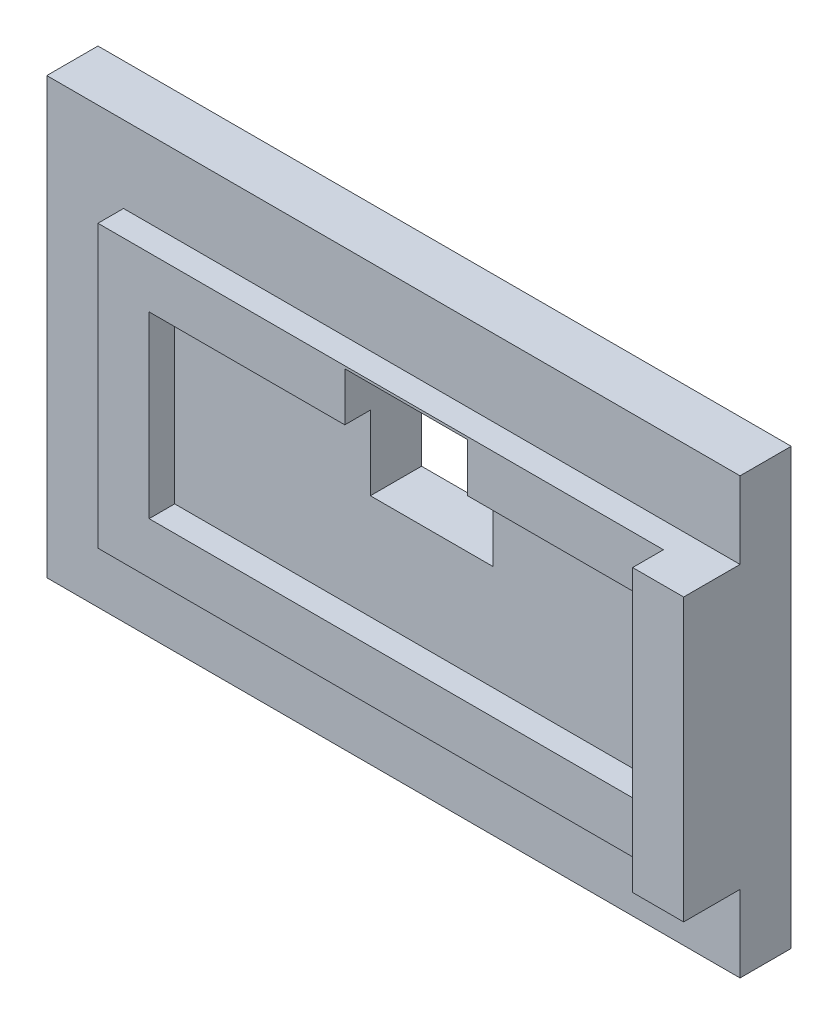
ISO-10303-21;
HEADER;
FILE_DESCRIPTION(('STEP AP214'),'2;1');
FILE_NAME('part.step','',(''),(''),'','','');
FILE_SCHEMA(('AUTOMOTIVE_DESIGN { 1 0 10303 214 1 1 1 1 }'));
ENDSEC;
DATA;
#1=APPLICATION_CONTEXT('core data for automotive mechanical design processes');
#2=APPLICATION_PROTOCOL_DEFINITION('international standard','automotive_design',2000,#1);
#3=PRODUCT_CONTEXT('',#1,'mechanical');
#4=PRODUCT('Part','Part','',(#3));
#5=PRODUCT_RELATED_PRODUCT_CATEGORY('part','',(#4));
#6=PRODUCT_DEFINITION_FORMATION('','',#4);
#7=PRODUCT_DEFINITION_CONTEXT('part definition',#1,'design');
#8=PRODUCT_DEFINITION('design','',#6,#7);
#9=PRODUCT_DEFINITION_SHAPE('','',#8);
#10=(LENGTH_UNIT() NAMED_UNIT(*) SI_UNIT(.MILLI.,.METRE.));
#11=(NAMED_UNIT(*) PLANE_ANGLE_UNIT() SI_UNIT($,.RADIAN.));
#12=(NAMED_UNIT(*) SI_UNIT($,.STERADIAN.) SOLID_ANGLE_UNIT());
#13=UNCERTAINTY_MEASURE_WITH_UNIT(LENGTH_MEASURE(1.E-05),#10,'distance_accuracy_value','');
#14=(GEOMETRIC_REPRESENTATION_CONTEXT(3) GLOBAL_UNCERTAINTY_ASSIGNED_CONTEXT((#13)) GLOBAL_UNIT_ASSIGNED_CONTEXT((#10,
#11,#12)) REPRESENTATION_CONTEXT('',''));
#15=CARTESIAN_POINT('',(0.,0.,0.));
#16=DIRECTION('',(0.,0.,1.));
#17=DIRECTION('',(1.,0.,0.));
#18=AXIS2_PLACEMENT_3D('',#15,#16,#17);
#19=CARTESIAN_POINT('',(-127.62484,44.44978283,38.1));
#20=DIRECTION('',(0.,-1.,0.));
#21=DIRECTION('',(1.,0.,0.));
#22=AXIS2_PLACEMENT_3D('',#19,#20,#21);
#23=PLANE('',#22);
#24=DIRECTION('',(0.,0.,-1.));
#25=VECTOR('',#24,1.);
#26=CARTESIAN_POINT('',(-30.48,44.44978283,38.1));
#27=LINE('',#26,#25);
#28=CARTESIAN_POINT('',(-30.48,44.44978283,38.1));
#29=VERTEX_POINT('',#28);
#30=CARTESIAN_POINT('',(-30.48,44.44978283,25.4));
#31=VERTEX_POINT('',#30);
#32=EDGE_CURVE('E235',#29,#31,#27,.T.);
#33=ORIENTED_EDGE('',*,*,#32,.F.);
#34=DIRECTION('',(-1.,0.,0.));
#35=VECTOR('',#34,1.);
#36=CARTESIAN_POINT('',(-127.62484,44.44978283,38.1));
#37=LINE('',#36,#35);
#38=CARTESIAN_POINT('',(-127.62484,44.44978283,38.1));
#39=VERTEX_POINT('',#38);
#40=EDGE_CURVE('E271',#29,#39,#37,.T.);
#41=ORIENTED_EDGE('',*,*,#40,.T.);
#42=DIRECTION('',(0.,0.,-1.));
#43=VECTOR('',#42,1.);
#44=CARTESIAN_POINT('',(-127.62484,44.44978283,38.1));
#45=LINE('',#44,#43);
#46=CARTESIAN_POINT('',(-127.62484,44.44978283,25.4));
#47=VERTEX_POINT('',#46);
#48=EDGE_CURVE('E275',#39,#47,#45,.T.);
#49=ORIENTED_EDGE('',*,*,#48,.T.);
#50=DIRECTION('',(-1.,0.,0.));
#51=VECTOR('',#50,1.);
#52=CARTESIAN_POINT('',(-127.62484,44.44978283,25.4));
#53=LINE('',#52,#51);
#54=EDGE_CURVE('E284',#31,#47,#53,.T.);
#55=ORIENTED_EDGE('',*,*,#54,.F.);
#56=EDGE_LOOP('',(#33,#41,#49,#55));
#57=FACE_BOUND('',#56,.T.);
#58=ADVANCED_FACE('F45',(#57),#23,.T.);
#59=CARTESIAN_POINT('',(0.,0.,38.1));
#60=DIRECTION('',(0.,0.,-1.));
#61=DIRECTION('',(-1.,0.,0.));
#62=AXIS2_PLACEMENT_3D('',#59,#60,#61);
#63=PLANE('',#62);
#64=ORIENTED_EDGE('',*,*,#40,.F.);
#65=DIRECTION('',(0.,1.,0.));
#66=VECTOR('',#65,1.);
#67=CARTESIAN_POINT('',(-30.48,0.,38.1));
#68=LINE('',#67,#66);
#69=CARTESIAN_POINT('',(-30.48,68.58,38.1));
#70=VERTEX_POINT('',#69);
#71=EDGE_CURVE('E237',#29,#70,#68,.T.);
#72=ORIENTED_EDGE('',*,*,#71,.T.);
#73=DIRECTION('',(1.,0.,0.));
#74=VECTOR('',#73,1.);
#75=CARTESIAN_POINT('',(0.,68.58,38.1));
#76=LINE('',#75,#74);
#77=CARTESIAN_POINT('',(30.48,68.58,38.1));
#78=VERTEX_POINT('',#77);
#79=EDGE_CURVE('E240',#70,#78,#76,.T.);
#80=ORIENTED_EDGE('',*,*,#79,.T.);
#81=DIRECTION('',(0.,-1.,0.));
#82=VECTOR('',#81,1.);
#83=CARTESIAN_POINT('',(30.48,0.,38.1));
#84=LINE('',#83,#82);
#85=CARTESIAN_POINT('',(30.48,44.44978283,38.1));
#86=VERTEX_POINT('',#85);
#87=EDGE_CURVE('E232',#78,#86,#84,.T.);
#88=ORIENTED_EDGE('',*,*,#87,.T.);
#89=CARTESIAN_POINT('',(127.62484,44.44978283,38.1));
#90=VERTEX_POINT('',#89);
#91=EDGE_CURVE('E272',#90,#86,#37,.T.);
#92=ORIENTED_EDGE('',*,*,#91,.F.);
#93=DIRECTION('',(0.,1.,0.));
#94=VECTOR('',#93,1.);
#95=CARTESIAN_POINT('',(127.62484,-44.44978283,38.1));
#96=LINE('',#95,#94);
#97=CARTESIAN_POINT('',(127.62484,-44.44978283,38.1));
#98=VERTEX_POINT('',#97);
#99=EDGE_CURVE('E268',#98,#90,#96,.T.);
#100=ORIENTED_EDGE('',*,*,#99,.F.);
#101=DIRECTION('',(1.,0.,0.));
#102=VECTOR('',#101,1.);
#103=CARTESIAN_POINT('',(-127.62484,-44.44978283,38.1));
#104=LINE('',#103,#102);
#105=CARTESIAN_POINT('',(-127.62484,-44.44978283,38.1));
#106=VERTEX_POINT('',#105);
#107=EDGE_CURVE('E265',#106,#98,#104,.T.);
#108=ORIENTED_EDGE('',*,*,#107,.F.);
#109=DIRECTION('',(0.,-1.,0.));
#110=VECTOR('',#109,1.);
#111=CARTESIAN_POINT('',(-127.62484,-44.44978283,38.1));
#112=LINE('',#111,#110);
#113=EDGE_CURVE('E263',#39,#106,#112,.T.);
#114=ORIENTED_EDGE('',*,*,#113,.F.);
#115=EDGE_LOOP('',(#64,#72,#80,#88,#92,#100,#108,#114));
#116=FACE_BOUND('',#115,.T.);
#117=DIRECTION('',(0.,-1.,0.));
#118=VECTOR('',#117,1.);
#119=CARTESIAN_POINT('',(127.696800697553,-69.84978283,38.1));
#120=LINE('',#119,#118);
#121=CARTESIAN_POINT('',(127.696800697553,69.84978283,38.1));
#122=VERTEX_POINT('',#121);
#123=CARTESIAN_POINT('',(127.696800697553,-69.84978283,38.1));
#124=VERTEX_POINT('',#123);
#125=EDGE_CURVE('E243',#122,#124,#120,.T.);
#126=ORIENTED_EDGE('',*,*,#125,.F.);
#127=DIRECTION('',(-1.,0.,0.));
#128=VECTOR('',#127,1.);
#129=CARTESIAN_POINT('',(-153.02484,69.84978283,38.1));
#130=LINE('',#129,#128);
#131=CARTESIAN_POINT('',(-153.02484,69.84978283,38.1));
#132=VERTEX_POINT('',#131);
#133=EDGE_CURVE('E298',#122,#132,#130,.T.);
#134=ORIENTED_EDGE('',*,*,#133,.T.);
#135=DIRECTION('',(0.,-1.,0.));
#136=VECTOR('',#135,1.);
#137=CARTESIAN_POINT('',(-153.02484,-69.84978283,38.1));
#138=LINE('',#137,#136);
#139=CARTESIAN_POINT('',(-153.02484,-69.84978283,38.1));
#140=VERTEX_POINT('',#139);
#141=EDGE_CURVE('E300',#132,#140,#138,.T.);
#142=ORIENTED_EDGE('',*,*,#141,.T.);
#143=DIRECTION('',(1.,0.,0.));
#144=VECTOR('',#143,1.);
#145=CARTESIAN_POINT('',(-153.02484,-69.84978283,38.1));
#146=LINE('',#145,#144);
#147=EDGE_CURVE('E303',#140,#124,#146,.T.);
#148=ORIENTED_EDGE('',*,*,#147,.T.);
#149=EDGE_LOOP('',(#126,#134,#142,#148));
#150=FACE_BOUND('',#149,.T.);
#151=ADVANCED_FACE('F355',(#116,#150),#63,.F.);
#152=CARTESIAN_POINT('',(0.,-107.95,25.4));
#153=DIRECTION('',(0.,1.,0.));
#154=DIRECTION('',(0.,0.,1.));
#155=AXIS2_PLACEMENT_3D('',#152,#153,#154);
#156=PLANE('',#155);
#157=DIRECTION('',(1.,0.,0.));
#158=VECTOR('',#157,1.);
#159=CARTESIAN_POINT('',(0.,-107.95,0.));
#160=LINE('',#159,#158);
#161=CARTESIAN_POINT('',(-191.12484,-107.95,0.));
#162=VERTEX_POINT('',#161);
#163=CARTESIAN_POINT('',(153.02484,-107.95,0.));
#164=VERTEX_POINT('',#163);
#165=EDGE_CURVE('E184',#162,#164,#160,.T.);
#166=ORIENTED_EDGE('',*,*,#165,.T.);
#167=DIRECTION('',(0.,0.,-1.));
#168=VECTOR('',#167,1.);
#169=CARTESIAN_POINT('',(153.02484,-107.95,25.4));
#170=LINE('',#169,#168);
#171=CARTESIAN_POINT('',(153.02484,-107.95,25.4));
#172=VERTEX_POINT('',#171);
#173=EDGE_CURVE('E331',#172,#164,#170,.T.);
#174=ORIENTED_EDGE('',*,*,#173,.F.);
#175=DIRECTION('',(1.,0.,0.));
#176=VECTOR('',#175,1.);
#177=CARTESIAN_POINT('',(0.,-107.95,25.4));
#178=LINE('',#177,#176);
#179=CARTESIAN_POINT('',(-191.12484,-107.95,25.4));
#180=VERTEX_POINT('',#179);
#181=EDGE_CURVE('E200',#180,#172,#178,.T.);
#182=ORIENTED_EDGE('',*,*,#181,.F.);
#183=DIRECTION('',(0.,0.,1.));
#184=VECTOR('',#183,1.);
#185=CARTESIAN_POINT('',(-191.12484,-107.95,0.));
#186=LINE('',#185,#184);
#187=EDGE_CURVE('E198',#162,#180,#186,.T.);
#188=ORIENTED_EDGE('',*,*,#187,.F.);
#189=EDGE_LOOP('',(#166,#174,#182,#188));
#190=FACE_BOUND('',#189,.T.);
#191=ADVANCED_FACE('F47',(#190),#156,.F.);
#192=CARTESIAN_POINT('',(153.02484,0.,25.4));
#193=DIRECTION('',(-1.,0.,0.));
#194=DIRECTION('',(0.,0.,1.));
#195=AXIS2_PLACEMENT_3D('',#192,#193,#194);
#196=PLANE('',#195);
#197=DIRECTION('',(0.,1.,0.));
#198=VECTOR('',#197,1.);
#199=CARTESIAN_POINT('',(153.02484,0.,0.));
#200=LINE('',#199,#198);
#201=CARTESIAN_POINT('',(153.02484,107.95,0.));
#202=VERTEX_POINT('',#201);
#203=EDGE_CURVE('E191',#164,#202,#200,.T.);
#204=ORIENTED_EDGE('',*,*,#203,.T.);
#205=DIRECTION('',(0.,0.,-1.));
#206=VECTOR('',#205,1.);
#207=CARTESIAN_POINT('',(153.02484,107.95,25.4));
#208=LINE('',#207,#206);
#209=CARTESIAN_POINT('',(153.02484,107.95,25.4));
#210=VERTEX_POINT('',#209);
#211=EDGE_CURVE('E326',#210,#202,#208,.T.);
#212=ORIENTED_EDGE('',*,*,#211,.F.);
#213=DIRECTION('',(0.,1.,0.));
#214=VECTOR('',#213,1.);
#215=CARTESIAN_POINT('',(153.02484,0.,25.4));
#216=LINE('',#215,#214);
#217=CARTESIAN_POINT('',(153.02484,69.84978283,25.4));
#218=VERTEX_POINT('',#217);
#219=EDGE_CURVE('E320',#218,#210,#216,.T.);
#220=ORIENTED_EDGE('',*,*,#219,.F.);
#221=DIRECTION('',(0.,0.,-1.));
#222=VECTOR('',#221,1.);
#223=CARTESIAN_POINT('',(153.02484,69.84978283,38.1));
#224=LINE('',#223,#222);
#225=CARTESIAN_POINT('',(153.02484,69.84978283,53.40096));
#226=VERTEX_POINT('',#225);
#227=EDGE_CURVE('E195',#226,#218,#224,.T.);
#228=ORIENTED_EDGE('',*,*,#227,.F.);
#229=DIRECTION('',(0.,1.,0.));
#230=VECTOR('',#229,1.);
#231=CARTESIAN_POINT('',(153.02484,-69.84978283,53.40096));
#232=LINE('',#231,#230);
#233=CARTESIAN_POINT('',(153.02484,-69.84978283,53.40096));
#234=VERTEX_POINT('',#233);
#235=EDGE_CURVE('E244',#234,#226,#232,.T.);
#236=ORIENTED_EDGE('',*,*,#235,.F.);
#237=DIRECTION('',(0.,0.,-1.));
#238=VECTOR('',#237,1.);
#239=CARTESIAN_POINT('',(153.02484,-69.84978283,38.1));
#240=LINE('',#239,#238);
#241=CARTESIAN_POINT('',(153.02484,-69.84978283,25.4));
#242=VERTEX_POINT('',#241);
#243=EDGE_CURVE('E305',#234,#242,#240,.T.);
#244=ORIENTED_EDGE('',*,*,#243,.T.);
#245=EDGE_CURVE('E322',#172,#242,#216,.T.);
#246=ORIENTED_EDGE('',*,*,#245,.F.);
#247=ORIENTED_EDGE('',*,*,#173,.T.);
#248=EDGE_LOOP('',(#204,#212,#220,#228,#236,#244,#246,#247));
#249=FACE_BOUND('',#248,.T.);
#250=ADVANCED_FACE('F421',(#249),#196,.F.);
#251=CARTESIAN_POINT('',(0.,107.95,25.4));
#252=DIRECTION('',(0.,1.,0.));
#253=DIRECTION('',(0.,0.,1.));
#254=AXIS2_PLACEMENT_3D('',#251,#252,#253);
#255=PLANE('',#254);
#256=DIRECTION('',(1.,0.,0.));
#257=VECTOR('',#256,1.);
#258=CARTESIAN_POINT('',(0.,107.95,0.));
#259=LINE('',#258,#257);
#260=CARTESIAN_POINT('',(-191.12484,107.95,0.));
#261=VERTEX_POINT('',#260);
#262=EDGE_CURVE('E321',#261,#202,#259,.T.);
#263=ORIENTED_EDGE('',*,*,#262,.F.);
#264=DIRECTION('',(0.,0.,-1.));
#265=VECTOR('',#264,1.);
#266=CARTESIAN_POINT('',(-191.12484,107.95,0.));
#267=LINE('',#266,#265);
#268=CARTESIAN_POINT('',(-191.12484,107.95,25.4));
#269=VERTEX_POINT('',#268);
#270=EDGE_CURVE('E209',#269,#261,#267,.T.);
#271=ORIENTED_EDGE('',*,*,#270,.F.);
#272=DIRECTION('',(1.,0.,0.));
#273=VECTOR('',#272,1.);
#274=CARTESIAN_POINT('',(0.,107.95,25.4));
#275=LINE('',#274,#273);
#276=EDGE_CURVE('E324',#269,#210,#275,.T.);
#277=ORIENTED_EDGE('',*,*,#276,.T.);
#278=ORIENTED_EDGE('',*,*,#211,.T.);
#279=EDGE_LOOP('',(#263,#271,#277,#278));
#280=FACE_BOUND('',#279,.T.);
#281=ADVANCED_FACE('F436',(#280),#255,.T.);
#282=CARTESIAN_POINT('',(-153.02484,0.,25.4));
#283=DIRECTION('',(-1.,0.,0.));
#284=DIRECTION('',(0.,0.,1.));
#285=AXIS2_PLACEMENT_3D('',#282,#283,#284);
#286=PLANE('',#285);
#287=DIRECTION('',(0.,1.,0.));
#288=VECTOR('',#287,1.);
#289=CARTESIAN_POINT('',(-153.02484,107.95,25.4));
#290=LINE('',#289,#288);
#291=CARTESIAN_POINT('',(-153.02484,-69.84978283,25.4));
#292=VERTEX_POINT('',#291);
#293=CARTESIAN_POINT('',(-153.02484,69.84978283,25.4));
#294=VERTEX_POINT('',#293);
#295=EDGE_CURVE('E11',#292,#294,#290,.T.);
#296=ORIENTED_EDGE('',*,*,#295,.F.);
#297=DIRECTION('',(0.,0.,-1.));
#298=VECTOR('',#297,1.);
#299=CARTESIAN_POINT('',(-153.02484,-69.84978283,38.1));
#300=LINE('',#299,#298);
#301=EDGE_CURVE('E311',#140,#292,#300,.T.);
#302=ORIENTED_EDGE('',*,*,#301,.F.);
#303=ORIENTED_EDGE('',*,*,#141,.F.);
#304=DIRECTION('',(0.,0.,-1.));
#305=VECTOR('',#304,1.);
#306=CARTESIAN_POINT('',(-153.02484,69.84978283,38.1));
#307=LINE('',#306,#305);
#308=EDGE_CURVE('E314',#132,#294,#307,.T.);
#309=ORIENTED_EDGE('',*,*,#308,.T.);
#310=EDGE_LOOP('',(#296,#302,#303,#309));
#311=FACE_BOUND('',#310,.T.);
#312=ADVANCED_FACE('F375',(#311),#286,.T.);
#313=CARTESIAN_POINT('',(0.,0.,25.4));
#314=DIRECTION('',(0.,0.,1.));
#315=DIRECTION('',(1.,0.,0.));
#316=AXIS2_PLACEMENT_3D('',#313,#314,#315);
#317=PLANE('',#316);
#318=DIRECTION('',(-1.,0.,0.));
#319=VECTOR('',#318,1.);
#320=CARTESIAN_POINT('',(-153.02484,69.84978283,25.4));
#321=LINE('',#320,#319);
#322=EDGE_CURVE('E297',#218,#294,#321,.T.);
#323=ORIENTED_EDGE('',*,*,#322,.F.);
#324=ORIENTED_EDGE('',*,*,#219,.T.);
#325=ORIENTED_EDGE('',*,*,#276,.F.);
#326=DIRECTION('',(0.,1.,0.));
#327=VECTOR('',#326,1.);
#328=CARTESIAN_POINT('',(-191.12484,107.95,25.4));
#329=LINE('',#328,#327);
#330=EDGE_CURVE('E204',#180,#269,#329,.T.);
#331=ORIENTED_EDGE('',*,*,#330,.F.);
#332=ORIENTED_EDGE('',*,*,#181,.T.);
#333=ORIENTED_EDGE('',*,*,#245,.T.);
#334=DIRECTION('',(1.,0.,0.));
#335=VECTOR('',#334,1.);
#336=CARTESIAN_POINT('',(-153.02484,-69.84978283,25.4));
#337=LINE('',#336,#335);
#338=EDGE_CURVE('E301',#292,#242,#337,.T.);
#339=ORIENTED_EDGE('',*,*,#338,.F.);
#340=ORIENTED_EDGE('',*,*,#295,.T.);
#341=EDGE_LOOP('',(#323,#324,#325,#331,#332,#333,#339,#340));
#342=FACE_BOUND('',#341,.T.);
#343=ADVANCED_FACE('F366',(#342),#317,.T.);
#344=CARTESIAN_POINT('',(0.,0.,0.));
#345=DIRECTION('',(0.,0.,1.));
#346=DIRECTION('',(1.,0.,0.));
#347=AXIS2_PLACEMENT_3D('',#344,#345,#346);
#348=PLANE('',#347);
#349=DIRECTION('',(1.,0.,0.));
#350=VECTOR('',#349,1.);
#351=CARTESIAN_POINT('',(30.48,68.58,0.));
#352=LINE('',#351,#350);
#353=CARTESIAN_POINT('',(-30.48,68.58,0.));
#354=VERTEX_POINT('',#353);
#355=CARTESIAN_POINT('',(30.48,68.58,0.));
#356=VERTEX_POINT('',#355);
#357=EDGE_CURVE('E215',#354,#356,#352,.T.);
#358=ORIENTED_EDGE('',*,*,#357,.F.);
#359=DIRECTION('',(0.,1.,0.));
#360=VECTOR('',#359,1.);
#361=CARTESIAN_POINT('',(-30.48,7.62,0.));
#362=LINE('',#361,#360);
#363=CARTESIAN_POINT('',(-30.48,7.62,0.));
#364=VERTEX_POINT('',#363);
#365=EDGE_CURVE('E61',#364,#354,#362,.T.);
#366=ORIENTED_EDGE('',*,*,#365,.F.);
#367=DIRECTION('',(-1.,0.,0.));
#368=VECTOR('',#367,1.);
#369=CARTESIAN_POINT('',(30.48,7.62,0.));
#370=LINE('',#369,#368);
#371=CARTESIAN_POINT('',(30.48,7.62,0.));
#372=VERTEX_POINT('',#371);
#373=EDGE_CURVE('E220',#372,#364,#370,.T.);
#374=ORIENTED_EDGE('',*,*,#373,.F.);
#375=DIRECTION('',(0.,-1.,0.));
#376=VECTOR('',#375,1.);
#377=CARTESIAN_POINT('',(30.48,7.62,0.));
#378=LINE('',#377,#376);
#379=EDGE_CURVE('E218',#356,#372,#378,.T.);
#380=ORIENTED_EDGE('',*,*,#379,.F.);
#381=EDGE_LOOP('',(#358,#366,#374,#380));
#382=FACE_BOUND('',#381,.T.);
#383=ORIENTED_EDGE('',*,*,#165,.F.);
#384=DIRECTION('',(0.,-1.,0.));
#385=VECTOR('',#384,1.);
#386=CARTESIAN_POINT('',(-191.12484,107.95,0.));
#387=LINE('',#386,#385);
#388=EDGE_CURVE('E189',#261,#162,#387,.T.);
#389=ORIENTED_EDGE('',*,*,#388,.F.);
#390=ORIENTED_EDGE('',*,*,#262,.T.);
#391=ORIENTED_EDGE('',*,*,#203,.F.);
#392=EDGE_LOOP('',(#383,#389,#390,#391));
#393=FACE_BOUND('',#392,.T.);
#394=ADVANCED_FACE('F186',(#382,#393),#348,.F.);
#395=CARTESIAN_POINT('',(-153.02484,69.84978283,38.1));
#396=DIRECTION('',(0.,-1.,0.));
#397=DIRECTION('',(0.,0.,-1.));
#398=AXIS2_PLACEMENT_3D('',#395,#396,#397);
#399=PLANE('',#398);
#400=ORIENTED_EDGE('',*,*,#322,.T.);
#401=ORIENTED_EDGE('',*,*,#308,.F.);
#402=ORIENTED_EDGE('',*,*,#133,.F.);
#403=DIRECTION('',(0.,0.,-1.));
#404=VECTOR('',#403,1.);
#405=CARTESIAN_POINT('',(127.696800697553,69.84978283,53.40096));
#406=LINE('',#405,#404);
#407=CARTESIAN_POINT('',(127.696800697553,69.84978283,53.40096));
#408=VERTEX_POINT('',#407);
#409=EDGE_CURVE('E259',#408,#122,#406,.T.);
#410=ORIENTED_EDGE('',*,*,#409,.F.);
#411=DIRECTION('',(-1.,0.,0.));
#412=VECTOR('',#411,1.);
#413=CARTESIAN_POINT('',(153.02484,69.84978283,53.40096));
#414=LINE('',#413,#412);
#415=EDGE_CURVE('E247',#226,#408,#414,.T.);
#416=ORIENTED_EDGE('',*,*,#415,.F.);
#417=ORIENTED_EDGE('',*,*,#227,.T.);
#418=EDGE_LOOP('',(#400,#401,#402,#410,#416,#417));
#419=FACE_BOUND('',#418,.T.);
#420=ADVANCED_FACE('F365',(#419),#399,.F.);
#421=CARTESIAN_POINT('',(-153.02484,-69.84978283,38.1));
#422=DIRECTION('',(0.,1.,0.));
#423=DIRECTION('',(0.,0.,1.));
#424=AXIS2_PLACEMENT_3D('',#421,#422,#423);
#425=PLANE('',#424);
#426=ORIENTED_EDGE('',*,*,#338,.T.);
#427=ORIENTED_EDGE('',*,*,#243,.F.);
#428=DIRECTION('',(1.,0.,0.));
#429=VECTOR('',#428,1.);
#430=CARTESIAN_POINT('',(153.02484,-69.84978283,53.40096));
#431=LINE('',#430,#429);
#432=CARTESIAN_POINT('',(127.696800697553,-69.84978283,53.40096));
#433=VERTEX_POINT('',#432);
#434=EDGE_CURVE('E251',#433,#234,#431,.T.);
#435=ORIENTED_EDGE('',*,*,#434,.F.);
#436=DIRECTION('',(0.,0.,-1.));
#437=VECTOR('',#436,1.);
#438=CARTESIAN_POINT('',(127.696800697553,-69.84978283,53.40096));
#439=LINE('',#438,#437);
#440=EDGE_CURVE('E254',#433,#124,#439,.T.);
#441=ORIENTED_EDGE('',*,*,#440,.T.);
#442=ORIENTED_EDGE('',*,*,#147,.F.);
#443=ORIENTED_EDGE('',*,*,#301,.T.);
#444=EDGE_LOOP('',(#426,#427,#435,#441,#442,#443));
#445=FACE_BOUND('',#444,.T.);
#446=ADVANCED_FACE('F372',(#445),#425,.F.);
#447=CARTESIAN_POINT('',(-127.62484,-44.44978283,38.1));
#448=DIRECTION('',(1.,0.,0.));
#449=DIRECTION('',(0.,0.,-1.));
#450=AXIS2_PLACEMENT_3D('',#447,#448,#449);
#451=PLANE('',#450);
#452=DIRECTION('',(0.,-1.,0.));
#453=VECTOR('',#452,1.);
#454=CARTESIAN_POINT('',(-127.62484,-44.44978283,25.4));
#455=LINE('',#454,#453);
#456=CARTESIAN_POINT('',(-127.62484,-44.44978283,25.4));
#457=VERTEX_POINT('',#456);
#458=EDGE_CURVE('E262',#47,#457,#455,.T.);
#459=ORIENTED_EDGE('',*,*,#458,.F.);
#460=ORIENTED_EDGE('',*,*,#48,.F.);
#461=ORIENTED_EDGE('',*,*,#113,.T.);
#462=DIRECTION('',(0.,0.,-1.));
#463=VECTOR('',#462,1.);
#464=CARTESIAN_POINT('',(-127.62484,-44.44978283,38.1));
#465=LINE('',#464,#463);
#466=EDGE_CURVE('E294',#106,#457,#465,.T.);
#467=ORIENTED_EDGE('',*,*,#466,.T.);
#468=EDGE_LOOP('',(#459,#460,#461,#467));
#469=FACE_BOUND('',#468,.T.);
#470=ADVANCED_FACE('F402',(#469),#451,.T.);
#471=CARTESIAN_POINT('',(-127.62484,-44.44978283,38.1));
#472=DIRECTION('',(0.,1.,0.));
#473=DIRECTION('',(0.,0.,1.));
#474=AXIS2_PLACEMENT_3D('',#471,#472,#473);
#475=PLANE('',#474);
#476=DIRECTION('',(1.,0.,0.));
#477=VECTOR('',#476,1.);
#478=CARTESIAN_POINT('',(-127.62484,-44.44978283,25.4));
#479=LINE('',#478,#477);
#480=CARTESIAN_POINT('',(127.62484,-44.44978283,25.4));
#481=VERTEX_POINT('',#480);
#482=EDGE_CURVE('E278',#457,#481,#479,.T.);
#483=ORIENTED_EDGE('',*,*,#482,.F.);
#484=ORIENTED_EDGE('',*,*,#466,.F.);
#485=ORIENTED_EDGE('',*,*,#107,.T.);
#486=DIRECTION('',(0.,0.,-1.));
#487=VECTOR('',#486,1.);
#488=CARTESIAN_POINT('',(127.62484,-44.44978283,38.1));
#489=LINE('',#488,#487);
#490=EDGE_CURVE('E292',#98,#481,#489,.T.);
#491=ORIENTED_EDGE('',*,*,#490,.T.);
#492=EDGE_LOOP('',(#483,#484,#485,#491));
#493=FACE_BOUND('',#492,.T.);
#494=ADVANCED_FACE('F396',(#493),#475,.T.);
#495=CARTESIAN_POINT('',(127.62484,-44.44978283,38.1));
#496=DIRECTION('',(-1.,0.,0.));
#497=DIRECTION('',(0.,0.,1.));
#498=AXIS2_PLACEMENT_3D('',#495,#496,#497);
#499=PLANE('',#498);
#500=DIRECTION('',(0.,1.,0.));
#501=VECTOR('',#500,1.);
#502=CARTESIAN_POINT('',(127.62484,-44.44978283,25.4));
#503=LINE('',#502,#501);
#504=CARTESIAN_POINT('',(127.62484,44.44978283,25.4));
#505=VERTEX_POINT('',#504);
#506=EDGE_CURVE('E281',#481,#505,#503,.T.);
#507=ORIENTED_EDGE('',*,*,#506,.F.);
#508=ORIENTED_EDGE('',*,*,#490,.F.);
#509=ORIENTED_EDGE('',*,*,#99,.T.);
#510=DIRECTION('',(0.,0.,-1.));
#511=VECTOR('',#510,1.);
#512=CARTESIAN_POINT('',(127.62484,44.44978283,38.1));
#513=LINE('',#512,#511);
#514=EDGE_CURVE('E289',#90,#505,#513,.T.);
#515=ORIENTED_EDGE('',*,*,#514,.T.);
#516=EDGE_LOOP('',(#507,#508,#509,#515));
#517=FACE_BOUND('',#516,.T.);
#518=ADVANCED_FACE('F390',(#517),#499,.T.);
#519=DIRECTION('',(0.,0.,1.));
#520=VECTOR('',#519,1.);
#521=CARTESIAN_POINT('',(30.48,44.44978283,38.1));
#522=LINE('',#521,#520);
#523=CARTESIAN_POINT('',(30.48,44.44978283,25.4));
#524=VERTEX_POINT('',#523);
#525=EDGE_CURVE('E226',#524,#86,#522,.T.);
#526=ORIENTED_EDGE('',*,*,#525,.F.);
#527=EDGE_CURVE('E266',#505,#524,#53,.T.);
#528=ORIENTED_EDGE('',*,*,#527,.F.);
#529=ORIENTED_EDGE('',*,*,#514,.F.);
#530=ORIENTED_EDGE('',*,*,#91,.T.);
#531=EDGE_LOOP('',(#526,#528,#529,#530));
#532=FACE_BOUND('',#531,.T.);
#533=ADVANCED_FACE('F350',(#532),#23,.T.);
#534=DIRECTION('',(0.,-1.,0.));
#535=VECTOR('',#534,1.);
#536=CARTESIAN_POINT('',(-30.48,0.,25.4));
#537=LINE('',#536,#535);
#538=CARTESIAN_POINT('',(-30.48,7.62,25.4));
#539=VERTEX_POINT('',#538);
#540=EDGE_CURVE('E49',#31,#539,#537,.T.);
#541=ORIENTED_EDGE('',*,*,#540,.F.);
#542=ORIENTED_EDGE('',*,*,#54,.T.);
#543=ORIENTED_EDGE('',*,*,#458,.T.);
#544=ORIENTED_EDGE('',*,*,#482,.T.);
#545=ORIENTED_EDGE('',*,*,#506,.T.);
#546=ORIENTED_EDGE('',*,*,#527,.T.);
#547=DIRECTION('',(0.,1.,0.));
#548=VECTOR('',#547,1.);
#549=CARTESIAN_POINT('',(30.48,0.,25.4));
#550=LINE('',#549,#548);
#551=CARTESIAN_POINT('',(30.48,7.62,25.4));
#552=VERTEX_POINT('',#551);
#553=EDGE_CURVE('E333',#552,#524,#550,.T.);
#554=ORIENTED_EDGE('',*,*,#553,.F.);
#555=DIRECTION('',(1.,0.,0.));
#556=VECTOR('',#555,1.);
#557=CARTESIAN_POINT('',(0.,7.62,25.4));
#558=LINE('',#557,#556);
#559=EDGE_CURVE('E334',#539,#552,#558,.T.);
#560=ORIENTED_EDGE('',*,*,#559,.F.);
#561=EDGE_LOOP('',(#541,#542,#543,#544,#545,#546,#554,#560));
#562=FACE_BOUND('',#561,.T.);
#563=ADVANCED_FACE('F346',(#562),#317,.T.);
#564=CARTESIAN_POINT('',(127.696800697553,-69.84978283,53.40096));
#565=DIRECTION('',(1.,0.,0.));
#566=DIRECTION('',(0.,0.,-1.));
#567=AXIS2_PLACEMENT_3D('',#564,#565,#566);
#568=PLANE('',#567);
#569=ORIENTED_EDGE('',*,*,#125,.T.);
#570=ORIENTED_EDGE('',*,*,#440,.F.);
#571=DIRECTION('',(0.,-1.,0.));
#572=VECTOR('',#571,1.);
#573=CARTESIAN_POINT('',(127.696800697553,-69.84978283,53.40096));
#574=LINE('',#573,#572);
#575=EDGE_CURVE('E249',#408,#433,#574,.T.);
#576=ORIENTED_EDGE('',*,*,#575,.F.);
#577=ORIENTED_EDGE('',*,*,#409,.T.);
#578=EDGE_LOOP('',(#569,#570,#576,#577));
#579=FACE_BOUND('',#578,.T.);
#580=ADVANCED_FACE('F394',(#579),#568,.F.);
#581=CARTESIAN_POINT('',(0.,0.,53.40096));
#582=DIRECTION('',(0.,0.,1.));
#583=DIRECTION('',(1.,0.,0.));
#584=AXIS2_PLACEMENT_3D('',#581,#582,#583);
#585=PLANE('',#584);
#586=ORIENTED_EDGE('',*,*,#235,.T.);
#587=ORIENTED_EDGE('',*,*,#415,.T.);
#588=ORIENTED_EDGE('',*,*,#575,.T.);
#589=ORIENTED_EDGE('',*,*,#434,.T.);
#590=EDGE_LOOP('',(#586,#587,#588,#589));
#591=FACE_BOUND('',#590,.T.);
#592=ADVANCED_FACE('F425',(#591),#585,.T.);
#593=CARTESIAN_POINT('',(30.48,68.58,53.40096));
#594=DIRECTION('',(0.,1.,0.));
#595=DIRECTION('',(0.,0.,1.));
#596=AXIS2_PLACEMENT_3D('',#593,#594,#595);
#597=PLANE('',#596);
#598=DIRECTION('',(0.,0.,-1.));
#599=VECTOR('',#598,1.);
#600=CARTESIAN_POINT('',(-30.48,68.58,53.40096));
#601=LINE('',#600,#599);
#602=EDGE_CURVE('E223',#70,#354,#601,.T.);
#603=ORIENTED_EDGE('',*,*,#602,.T.);
#604=ORIENTED_EDGE('',*,*,#357,.T.);
#605=DIRECTION('',(0.,0.,-1.));
#606=VECTOR('',#605,1.);
#607=CARTESIAN_POINT('',(30.48,68.58,53.40096));
#608=LINE('',#607,#606);
#609=EDGE_CURVE('E228',#78,#356,#608,.T.);
#610=ORIENTED_EDGE('',*,*,#609,.F.);
#611=ORIENTED_EDGE('',*,*,#79,.F.);
#612=EDGE_LOOP('',(#603,#604,#610,#611));
#613=FACE_BOUND('',#612,.T.);
#614=ADVANCED_FACE('F360',(#613),#597,.F.);
#615=CARTESIAN_POINT('',(-30.48,7.62,53.40096));
#616=DIRECTION('',(-1.,0.,0.));
#617=DIRECTION('',(0.,0.,1.));
#618=AXIS2_PLACEMENT_3D('',#615,#616,#617);
#619=PLANE('',#618);
#620=ORIENTED_EDGE('',*,*,#32,.T.);
#621=ORIENTED_EDGE('',*,*,#540,.T.);
#622=DIRECTION('',(0.,0.,-1.));
#623=VECTOR('',#622,1.);
#624=CARTESIAN_POINT('',(-30.48,7.62,53.40096));
#625=LINE('',#624,#623);
#626=EDGE_CURVE('E224',#539,#364,#625,.T.);
#627=ORIENTED_EDGE('',*,*,#626,.T.);
#628=ORIENTED_EDGE('',*,*,#365,.T.);
#629=ORIENTED_EDGE('',*,*,#602,.F.);
#630=ORIENTED_EDGE('',*,*,#71,.F.);
#631=EDGE_LOOP('',(#620,#621,#627,#628,#629,#630));
#632=FACE_BOUND('',#631,.T.);
#633=ADVANCED_FACE('F340',(#632),#619,.F.);
#634=CARTESIAN_POINT('',(30.48,7.62,53.40096));
#635=DIRECTION('',(1.,0.,0.));
#636=DIRECTION('',(0.,0.,-1.));
#637=AXIS2_PLACEMENT_3D('',#634,#635,#636);
#638=PLANE('',#637);
#639=ORIENTED_EDGE('',*,*,#609,.T.);
#640=ORIENTED_EDGE('',*,*,#379,.T.);
#641=DIRECTION('',(0.,0.,-1.));
#642=VECTOR('',#641,1.);
#643=CARTESIAN_POINT('',(30.48,7.62,53.40096));
#644=LINE('',#643,#642);
#645=EDGE_CURVE('E69',#552,#372,#644,.T.);
#646=ORIENTED_EDGE('',*,*,#645,.F.);
#647=ORIENTED_EDGE('',*,*,#553,.T.);
#648=ORIENTED_EDGE('',*,*,#525,.T.);
#649=ORIENTED_EDGE('',*,*,#87,.F.);
#650=EDGE_LOOP('',(#639,#640,#646,#647,#648,#649));
#651=FACE_BOUND('',#650,.T.);
#652=ADVANCED_FACE('F348',(#651),#638,.F.);
#653=CARTESIAN_POINT('',(30.48,7.62,53.40096));
#654=DIRECTION('',(0.,-1.,0.));
#655=DIRECTION('',(0.,0.,-1.));
#656=AXIS2_PLACEMENT_3D('',#653,#654,#655);
#657=PLANE('',#656);
#658=ORIENTED_EDGE('',*,*,#559,.T.);
#659=ORIENTED_EDGE('',*,*,#645,.T.);
#660=ORIENTED_EDGE('',*,*,#373,.T.);
#661=ORIENTED_EDGE('',*,*,#626,.F.);
#662=EDGE_LOOP('',(#658,#659,#660,#661));
#663=FACE_BOUND('',#662,.T.);
#664=ADVANCED_FACE('F344',(#663),#657,.F.);
#665=CARTESIAN_POINT('',(-191.12484,0.,0.));
#666=DIRECTION('',(-1.,0.,0.));
#667=DIRECTION('',(0.,0.,1.));
#668=AXIS2_PLACEMENT_3D('',#665,#666,#667);
#669=PLANE('',#668);
#670=ORIENTED_EDGE('',*,*,#388,.T.);
#671=ORIENTED_EDGE('',*,*,#187,.T.);
#672=ORIENTED_EDGE('',*,*,#330,.T.);
#673=ORIENTED_EDGE('',*,*,#270,.T.);
#674=EDGE_LOOP('',(#670,#671,#672,#673));
#675=FACE_BOUND('',#674,.T.);
#676=ADVANCED_FACE('F207',(#675),#669,.T.);
#677=CLOSED_SHELL('',(#58,#151,#191,#250,#281,#312,#343,#394,#420,#446,#470,#494,#518,#533,#563,
#580,#592,#614,#633,#652,#664,#676));
#678=MANIFOLD_SOLID_BREP('B2',#677);
#679=ADVANCED_BREP_SHAPE_REPRESENTATION('',(#18,#678),#14);
#680=SHAPE_DEFINITION_REPRESENTATION(#9,#679);
ENDSEC;
END-ISO-10303-21;
